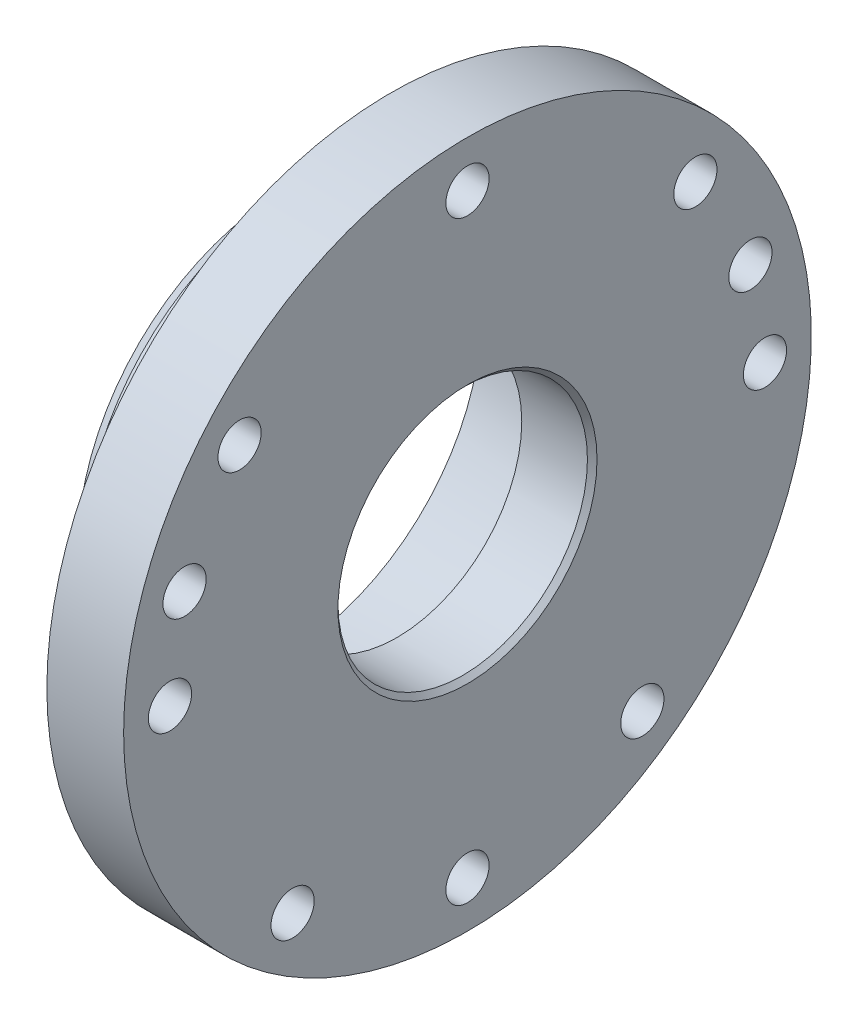
ISO-10303-21;
HEADER;
FILE_DESCRIPTION(('STEP AP214'),'2;1');
FILE_NAME('part.step','',(''),(''),'','','');
FILE_SCHEMA(('AUTOMOTIVE_DESIGN { 1 0 10303 214 1 1 1 1 }'));
ENDSEC;
DATA;
#1=APPLICATION_CONTEXT('core data for automotive mechanical design processes');
#2=APPLICATION_PROTOCOL_DEFINITION('international standard','automotive_design',2000,#1);
#3=PRODUCT_CONTEXT('',#1,'mechanical');
#4=PRODUCT('Part','Part','',(#3));
#5=PRODUCT_RELATED_PRODUCT_CATEGORY('part','',(#4));
#6=PRODUCT_DEFINITION_FORMATION('','',#4);
#7=PRODUCT_DEFINITION_CONTEXT('part definition',#1,'design');
#8=PRODUCT_DEFINITION('design','',#6,#7);
#9=PRODUCT_DEFINITION_SHAPE('','',#8);
#10=(LENGTH_UNIT() NAMED_UNIT(*) SI_UNIT(.MILLI.,.METRE.));
#11=(NAMED_UNIT(*) PLANE_ANGLE_UNIT() SI_UNIT($,.RADIAN.));
#12=(NAMED_UNIT(*) SI_UNIT($,.STERADIAN.) SOLID_ANGLE_UNIT());
#13=UNCERTAINTY_MEASURE_WITH_UNIT(LENGTH_MEASURE(1.E-05),#10,'distance_accuracy_value','');
#14=(GEOMETRIC_REPRESENTATION_CONTEXT(3) GLOBAL_UNCERTAINTY_ASSIGNED_CONTEXT((#13)) GLOBAL_UNIT_ASSIGNED_CONTEXT((#10,
#11,#12)) REPRESENTATION_CONTEXT('',''));
#15=CARTESIAN_POINT('',(0.,0.,0.));
#16=DIRECTION('',(0.,0.,1.));
#17=DIRECTION('',(1.,0.,0.));
#18=AXIS2_PLACEMENT_3D('',#15,#16,#17);
#19=CARTESIAN_POINT('',(0.,0.,0.));
#20=DIRECTION('',(-1.,0.,0.));
#21=DIRECTION('',(0.,0.,1.));
#22=AXIS2_PLACEMENT_3D('',#19,#20,#21);
#23=CYLINDRICAL_SURFACE('',#22,70.0151);
#24=CARTESIAN_POINT('',(34.3408,0.,0.));
#25=DIRECTION('',(1.,0.,0.));
#26=DIRECTION('',(0.,0.,-1.));
#27=AXIS2_PLACEMENT_3D('',#24,#25,#26);
#28=CIRCLE('',#27,70.0151);
#29=CARTESIAN_POINT('',(34.3408,0.,-70.0151));
#30=VERTEX_POINT('',#29);
#31=EDGE_CURVE('E208',#30,#30,#28,.F.);
#32=ORIENTED_EDGE('',*,*,#31,.T.);
#33=EDGE_LOOP('',(#32));
#34=FACE_BOUND('',#33,.T.);
#35=CARTESIAN_POINT('',(25.6794,0.,0.));
#36=DIRECTION('',(-1.,0.,0.));
#37=DIRECTION('',(0.,0.,1.));
#38=AXIS2_PLACEMENT_3D('',#35,#36,#37);
#39=CIRCLE('',#38,70.0151);
#40=CARTESIAN_POINT('',(25.6794,0.,70.0151));
#41=VERTEX_POINT('',#40);
#42=EDGE_CURVE('E136',#41,#41,#39,.T.);
#43=ORIENTED_EDGE('',*,*,#42,.F.);
#44=EDGE_LOOP('',(#43));
#45=FACE_BOUND('',#44,.T.);
#46=ADVANCED_FACE('F35',(#34,#45),#23,.T.);
#47=CARTESIAN_POINT('',(3.17500000000002,0.,0.));
#48=DIRECTION('',(1.,0.,0.));
#49=DIRECTION('',(0.,0.,-1.));
#50=AXIS2_PLACEMENT_3D('',#47,#48,#49);
#51=CIRCLE('',#50,70.0151);
#52=CARTESIAN_POINT('',(3.17500000000002,-69.5637141170596,-7.9375));
#53=VERTEX_POINT('',#52);
#54=CARTESIAN_POINT('',(3.17500000000002,-69.5637141170596,7.9375));
#55=VERTEX_POINT('',#54);
#56=EDGE_CURVE('E217',#53,#55,#51,.T.);
#57=ORIENTED_EDGE('',*,*,#56,.T.);
#58=DIRECTION('',(-1.,0.,0.));
#59=VECTOR('',#58,1.);
#60=CARTESIAN_POINT('',(0.,-69.5637141170596,7.9375));
#61=LINE('',#60,#59);
#62=CARTESIAN_POINT('',(12.7,-69.5637141170596,7.9375));
#63=VERTEX_POINT('',#62);
#64=EDGE_CURVE('E60',#55,#63,#61,.F.);
#65=ORIENTED_EDGE('',*,*,#64,.T.);
#66=CARTESIAN_POINT('',(12.7,0.,0.));
#67=DIRECTION('',(1.,0.,0.));
#68=DIRECTION('',(0.,0.,-1.));
#69=AXIS2_PLACEMENT_3D('',#66,#67,#68);
#70=CIRCLE('',#69,70.0151);
#71=CARTESIAN_POINT('',(12.7,-69.5637141170596,-7.9375));
#72=VERTEX_POINT('',#71);
#73=EDGE_CURVE('E100',#63,#72,#70,.T.);
#74=ORIENTED_EDGE('',*,*,#73,.T.);
#75=DIRECTION('',(-1.,0.,0.));
#76=VECTOR('',#75,1.);
#77=CARTESIAN_POINT('',(0.,-69.5637141170596,-7.9375));
#78=LINE('',#77,#76);
#79=EDGE_CURVE('E84',#72,#53,#78,.T.);
#80=ORIENTED_EDGE('',*,*,#79,.T.);
#81=EDGE_LOOP('',(#57,#65,#74,#80));
#82=FACE_BOUND('',#81,.T.);
#83=CARTESIAN_POINT('',(20.8788,0.,0.));
#84=DIRECTION('',(1.,0.,0.));
#85=DIRECTION('',(0.,0.,-1.));
#86=AXIS2_PLACEMENT_3D('',#83,#84,#85);
#87=CIRCLE('',#86,70.0151);
#88=CARTESIAN_POINT('',(20.8788,0.,-70.0151));
#89=VERTEX_POINT('',#88);
#90=EDGE_CURVE('E122',#89,#89,#87,.T.);
#91=ORIENTED_EDGE('',*,*,#90,.F.);
#92=EDGE_LOOP('',(#91));
#93=FACE_BOUND('',#92,.T.);
#94=ADVANCED_FACE('F102',(#82,#93),#23,.T.);
#95=CARTESIAN_POINT('',(0.,0.,0.));
#96=DIRECTION('',(-1.,0.,0.));
#97=DIRECTION('',(0.,0.,1.));
#98=AXIS2_PLACEMENT_3D('',#95,#96,#97);
#99=CONICAL_SURFACE('',#98,65.0875,0.0872664625997166);
#100=CARTESIAN_POINT('',(30.2297267597372,0.,0.));
#101=DIRECTION('',(-1.,0.,0.));
#102=DIRECTION('',(0.,0.,1.));
#103=AXIS2_PLACEMENT_3D('',#100,#101,#102);
#104=CIRCLE('',#103,62.4427416070367);
#105=CARTESIAN_POINT('',(30.2297267597372,0.,62.4427416070367));
#106=VERTEX_POINT('',#105);
#107=EDGE_CURVE('E199',#106,#106,#104,.T.);
#108=ORIENTED_EDGE('',*,*,#107,.F.);
#109=EDGE_LOOP('',(#108));
#110=FACE_BOUND('',#109,.T.);
#111=CARTESIAN_POINT('',(12.7,0.,0.));
#112=DIRECTION('',(1.,0.,0.));
#113=DIRECTION('',(0.,0.,-1.));
#114=AXIS2_PLACEMENT_3D('',#111,#112,#113);
#115=CIRCLE('',#114,63.9763939732208);
#116=CARTESIAN_POINT('',(12.7,-63.4820847134588,-7.9375));
#117=VERTEX_POINT('',#116);
#118=CARTESIAN_POINT('',(12.7,-63.4820847134588,7.9375));
#119=VERTEX_POINT('',#118);
#120=EDGE_CURVE('E11',#117,#119,#115,.F.);
#121=ORIENTED_EDGE('',*,*,#120,.T.);
#122=CARTESIAN_POINT('',(79.0151504731022,-57.6305188119541,7.9375));
#123=CARTESIAN_POINT('',(61.2473709320741,-59.1996496180577,7.9375));
#124=CARTESIAN_POINT('',(43.4794910551502,-60.7676438073892,7.9375));
#125=CARTESIAN_POINT('',(7.94356542547058,-63.9017502639271,7.9375));
#126=CARTESIAN_POINT('',(-9.82448032728422,-65.4678625311449,7.9375));
#127=CARTESIAN_POINT('',(-34.0463349213385,-67.6018029546642,7.9375));
#128=CARTESIAN_POINT('',(-40.5000867762412,-68.1702780805867,7.9375));
#129=CARTESIAN_POINT('',(-53.4076067240651,-69.3070441176885,7.9375));
#130=CARTESIAN_POINT('',(-59.8613748169862,-69.8753350288673,7.9375));
#131=CARTESIAN_POINT('',(-66.3151504731022,-70.4435400503315,7.9375));
#132=B_SPLINE_CURVE_WITH_KNOTS('',3,(#122,#123,#124,#125,#126,#127,#128,#129,#130,#131),
.UNSPECIFIED.,.F.,.F.,(4,2,2,2,4),(0.,53.5107974305862,107.021594538209,126.457815691513,
145.894036887121),.UNSPECIFIED.);
#133=CARTESIAN_POINT('',(0.,-64.6016930892682,7.9375));
#134=VERTEX_POINT('',#133);
#135=EDGE_CURVE('E105',#119,#134,#132,.T.);
#136=ORIENTED_EDGE('',*,*,#135,.T.);
#137=CARTESIAN_POINT('',(0.,0.,0.));
#138=DIRECTION('',(-1.,0.,0.));
#139=DIRECTION('',(0.,0.,1.));
#140=AXIS2_PLACEMENT_3D('',#137,#138,#139);
#141=CIRCLE('',#140,65.0875);
#142=CARTESIAN_POINT('',(0.,-64.6016930892682,-7.9375));
#143=VERTEX_POINT('',#142);
#144=EDGE_CURVE('E182',#134,#143,#141,.T.);
#145=ORIENTED_EDGE('',*,*,#144,.T.);
#146=CARTESIAN_POINT('',(-66.3151504731022,-70.4435400503315,-7.9375));
#147=CARTESIAN_POINT('',(-55.489322891296,-69.4904082780563,-7.9375));
#148=CARTESIAN_POINT('',(-44.6635163076476,-68.5370380440227,-7.9375));
#149=CARTESIAN_POINT('',(-23.0119512193014,-66.6297515457216,-7.9375));
#150=CARTESIAN_POINT('',(-12.1861927146037,-65.675835281453,-7.9375));
#151=CARTESIAN_POINT('',(20.2910012596043,-62.813163809436,-7.9375));
#152=CARTESIAN_POINT('',(41.9423554229091,-60.9034859019059,-7.9375));
#153=CARTESIAN_POINT('',(68.7341021620195,-58.538384669189,-7.9375));
#154=CARTESIAN_POINT('',(73.8746306141872,-58.0845003920235,-7.9375));
#155=CARTESIAN_POINT('',(79.0151504731022,-57.6305188119541,-7.9375));
#156=B_SPLINE_CURVE_WITH_KNOTS('',3,(#146,#147,#148,#149,#150,#151,#152,#153,#154,#155),
.UNSPECIFIED.,.F.,.F.,(4,2,2,2,4),(0.,32.6031137518608,65.2062275677975,130.412454495922,
145.894036884604),.UNSPECIFIED.);
#157=EDGE_CURVE('E94',#143,#117,#156,.T.);
#158=ORIENTED_EDGE('',*,*,#157,.T.);
#159=EDGE_LOOP('',(#121,#136,#145,#158));
#160=FACE_BOUND('',#159,.T.);
#161=ADVANCED_FACE('F244',(#110,#160),#99,.F.);
#162=CARTESIAN_POINT('',(29.5656,0.,0.));
#163=DIRECTION('',(-1.,0.,0.));
#164=DIRECTION('',(0.,0.,1.));
#165=AXIS2_PLACEMENT_3D('',#162,#163,#164);
#166=TOROIDAL_SURFACE('',#165,54.8517380075776,7.62);
#167=CARTESIAN_POINT('',(37.1856,0.,0.));
#168=DIRECTION('',(-1.,0.,0.));
#169=DIRECTION('',(0.,0.,1.));
#170=AXIS2_PLACEMENT_3D('',#167,#168,#169);
#171=CIRCLE('',#170,54.8517380075776);
#172=CARTESIAN_POINT('',(37.1856,0.,54.8517380075776));
#173=VERTEX_POINT('',#172);
#174=EDGE_CURVE('E196',#173,#173,#171,.T.);
#175=ORIENTED_EDGE('',*,*,#174,.F.);
#176=EDGE_LOOP('',(#175));
#177=FACE_BOUND('',#176,.T.);
#178=ORIENTED_EDGE('',*,*,#107,.T.);
#179=EDGE_LOOP('',(#178));
#180=FACE_BOUND('',#179,.T.);
#181=ADVANCED_FACE('F249',(#177,#180),#166,.F.);
#182=CARTESIAN_POINT('',(37.1856,41.275,0.));
#183=DIRECTION('',(1.,0.,0.));
#184=DIRECTION('',(0.,0.,-1.));
#185=AXIS2_PLACEMENT_3D('',#182,#183,#184);
#186=PLANE('',#185);
#187=CARTESIAN_POINT('',(37.1856,0.,0.));
#188=DIRECTION('',(-1.,0.,0.));
#189=DIRECTION('',(0.,0.,1.));
#190=AXIS2_PLACEMENT_3D('',#187,#188,#189);
#191=CIRCLE('',#190,41.275);
#192=CARTESIAN_POINT('',(37.1856,0.,41.275));
#193=VERTEX_POINT('',#192);
#194=EDGE_CURVE('E193',#193,#193,#191,.T.);
#195=ORIENTED_EDGE('',*,*,#194,.F.);
#196=EDGE_LOOP('',(#195));
#197=FACE_BOUND('',#196,.T.);
#198=ORIENTED_EDGE('',*,*,#174,.T.);
#199=EDGE_LOOP('',(#198));
#200=FACE_BOUND('',#199,.T.);
#201=ADVANCED_FACE('F300',(#197,#200),#186,.F.);
#202=CARTESIAN_POINT('',(0.,0.,0.));
#203=DIRECTION('',(-1.,0.,0.));
#204=DIRECTION('',(0.,0.,1.));
#205=AXIS2_PLACEMENT_3D('',#202,#203,#204);
#206=CYLINDRICAL_SURFACE('',#205,41.275);
#207=CARTESIAN_POINT('',(58.9153000000001,0.,0.));
#208=DIRECTION('',(-1.,0.,0.));
#209=DIRECTION('',(0.,0.,1.));
#210=AXIS2_PLACEMENT_3D('',#207,#208,#209);
#211=CIRCLE('',#210,41.275);
#212=CARTESIAN_POINT('',(58.9153000000001,0.,-41.275));
#213=VERTEX_POINT('',#212);
#214=EDGE_CURVE('E205',#213,#213,#211,.F.);
#215=ORIENTED_EDGE('',*,*,#214,.T.);
#216=EDGE_LOOP('',(#215));
#217=FACE_BOUND('',#216,.T.);
#218=ORIENTED_EDGE('',*,*,#194,.T.);
#219=EDGE_LOOP('',(#218));
#220=FACE_BOUND('',#219,.T.);
#221=ADVANCED_FACE('F297',(#217,#220),#206,.F.);
#222=CARTESIAN_POINT('',(60.5028,113.7666,0.));
#223=DIRECTION('',(-1.,0.,0.));
#224=DIRECTION('',(0.,0.,1.));
#225=AXIS2_PLACEMENT_3D('',#222,#223,#224);
#226=PLANE('',#225);
#227=CARTESIAN_POINT('',(60.5028,63.266370483398,-75.3979243139851));
#228=DIRECTION('',(-1.,0.,0.));
#229=DIRECTION('',(0.,-0.766044443118975,-0.642787609686543));
#230=AXIS2_PLACEMENT_3D('',#227,#228,#229);
#231=CIRCLE('',#230,7.1501);
#232=CARTESIAN_POINT('',(60.5028,57.789076110653,-79.9939200020049));
#233=VERTEX_POINT('',#232);
#234=EDGE_CURVE('E123',#233,#233,#231,.T.);
#235=ORIENTED_EDGE('',*,*,#234,.T.);
#236=EDGE_LOOP('',(#235));
#237=FACE_BOUND('',#236,.T.);
#238=CARTESIAN_POINT('',(60.5028,63.266370483397,75.397924313986));
#239=DIRECTION('',(-1.,0.,0.));
#240=DIRECTION('',(0.,0.766044443118984,-0.642787609686533));
#241=AXIS2_PLACEMENT_3D('',#238,#239,#240);
#242=CIRCLE('',#241,7.1501);
#243=CARTESIAN_POINT('',(60.5028,68.743664856142,70.8019286259663));
#244=VERTEX_POINT('',#243);
#245=EDGE_CURVE('E130',#244,#244,#242,.T.);
#246=ORIENTED_EDGE('',*,*,#245,.T.);
#247=EDGE_LOOP('',(#246));
#248=FACE_BOUND('',#247,.T.);
#249=CARTESIAN_POINT('',(60.5028,-98.425,0.));
#250=DIRECTION('',(-1.,0.,0.));
#251=DIRECTION('',(0.,0.,1.));
#252=AXIS2_PLACEMENT_3D('',#249,#250,#251);
#253=CIRCLE('',#252,7.1501);
#254=CARTESIAN_POINT('',(60.5028,-98.425,7.1501));
#255=VERTEX_POINT('',#254);
#256=EDGE_CURVE('E137',#255,#255,#253,.T.);
#257=ORIENTED_EDGE('',*,*,#256,.T.);
#258=EDGE_LOOP('',(#257));
#259=FACE_BOUND('',#258,.T.);
#260=CARTESIAN_POINT('',(60.5028,0.,98.425));
#261=DIRECTION('',(1.,0.,0.));
#262=DIRECTION('',(0.,0.,-1.));
#263=AXIS2_PLACEMENT_3D('',#260,#261,#262);
#264=CIRCLE('',#263,7.15009999999999);
#265=CARTESIAN_POINT('',(60.5028,0.,91.2749));
#266=VERTEX_POINT('',#265);
#267=EDGE_CURVE('E143',#266,#266,#264,.T.);
#268=ORIENTED_EDGE('',*,*,#267,.F.);
#269=EDGE_LOOP('',(#268));
#270=FACE_BOUND('',#269,.T.);
#271=CARTESIAN_POINT('',(60.5028,0.,-98.425));
#272=DIRECTION('',(-1.,0.,0.));
#273=DIRECTION('',(0.,0.,1.));
#274=AXIS2_PLACEMENT_3D('',#271,#272,#273);
#275=CIRCLE('',#274,7.15009999999999);
#276=CARTESIAN_POINT('',(60.5028,0.,-91.2749));
#277=VERTEX_POINT('',#276);
#278=EDGE_CURVE('E149',#277,#277,#275,.T.);
#279=ORIENTED_EDGE('',*,*,#278,.T.);
#280=EDGE_LOOP('',(#279));
#281=FACE_BOUND('',#280,.T.);
#282=CARTESIAN_POINT('',(60.5028,30.4149976713539,-93.6077376163506));
#283=DIRECTION('',(-1.,0.,0.));
#284=DIRECTION('',(0.,0.951056516295155,0.309016994374945));
#285=AXIS2_PLACEMENT_3D('',#282,#283,#284);
#286=CIRCLE('',#285,7.1501);
#287=CARTESIAN_POINT('',(60.5028,37.2151468685159,-91.3982352048703));
#288=VERTEX_POINT('',#287);
#289=EDGE_CURVE('E155',#288,#288,#286,.T.);
#290=ORIENTED_EDGE('',*,*,#289,.T.);
#291=EDGE_LOOP('',(#290));
#292=FACE_BOUND('',#291,.T.);
#293=CARTESIAN_POINT('',(60.5028,-79.6274976713545,-57.8527634568862));
#294=DIRECTION('',(-1.,0.,0.));
#295=DIRECTION('',(0.,0.587785252292469,-0.809016994374951));
#296=AXIS2_PLACEMENT_3D('',#293,#294,#295);
#297=CIRCLE('',#296,7.1501);
#298=CARTESIAN_POINT('',(60.5028,-75.4247743389381,-63.6373158683665));
#299=VERTEX_POINT('',#298);
#300=EDGE_CURVE('E162',#299,#299,#297,.T.);
#301=ORIENTED_EDGE('',*,*,#300,.T.);
#302=EDGE_LOOP('',(#301));
#303=FACE_BOUND('',#302,.T.);
#304=CARTESIAN_POINT('',(60.5028,-79.6274976713537,57.8527634568874));
#305=DIRECTION('',(-1.,0.,0.));
#306=DIRECTION('',(0.,-0.58778525229248,-0.809016994374942));
#307=AXIS2_PLACEMENT_3D('',#304,#305,#306);
#308=CIRCLE('',#307,7.1501);
#309=CARTESIAN_POINT('',(60.5028,-83.8302210037701,52.0682110454071));
#310=VERTEX_POINT('',#309);
#311=EDGE_CURVE('E168',#310,#310,#308,.T.);
#312=ORIENTED_EDGE('',*,*,#311,.T.);
#313=EDGE_LOOP('',(#312));
#314=FACE_BOUND('',#313,.T.);
#315=CARTESIAN_POINT('',(60.5028,30.4149976713553,93.6077376163501));
#316=DIRECTION('',(-1.,0.,0.));
#317=DIRECTION('',(0.,-0.95105651629515,0.309016994374958));
#318=AXIS2_PLACEMENT_3D('',#315,#316,#317);
#319=CIRCLE('',#318,7.1501);
#320=CARTESIAN_POINT('',(60.5028,23.6148484741933,95.8172400278305));
#321=VERTEX_POINT('',#320);
#322=EDGE_CURVE('E174',#321,#321,#319,.T.);
#323=ORIENTED_EDGE('',*,*,#322,.T.);
#324=EDGE_LOOP('',(#323));
#325=FACE_BOUND('',#324,.T.);
#326=CARTESIAN_POINT('',(60.5028,98.425,0.));
#327=DIRECTION('',(-1.,0.,0.));
#328=DIRECTION('',(0.,0.,1.));
#329=AXIS2_PLACEMENT_3D('',#326,#327,#328);
#330=CIRCLE('',#329,7.1501);
#331=CARTESIAN_POINT('',(60.5028,98.425,7.1501));
#332=VERTEX_POINT('',#331);
#333=EDGE_CURVE('E179',#332,#332,#330,.T.);
#334=ORIENTED_EDGE('',*,*,#333,.T.);
#335=EDGE_LOOP('',(#334));
#336=FACE_BOUND('',#335,.T.);
#337=CARTESIAN_POINT('',(60.5028,0.,0.));
#338=DIRECTION('',(-1.,0.,0.));
#339=DIRECTION('',(0.,0.,1.));
#340=AXIS2_PLACEMENT_3D('',#337,#338,#339);
#341=CIRCLE('',#340,42.8624999999999);
#342=CARTESIAN_POINT('',(60.5028,0.,-42.8624999999999));
#343=VERTEX_POINT('',#342);
#344=EDGE_CURVE('E202',#343,#343,#341,.T.);
#345=ORIENTED_EDGE('',*,*,#344,.T.);
#346=EDGE_LOOP('',(#345));
#347=FACE_BOUND('',#346,.T.);
#348=CARTESIAN_POINT('',(60.5028,0.,0.));
#349=DIRECTION('',(-1.,0.,0.));
#350=DIRECTION('',(0.,0.,1.));
#351=AXIS2_PLACEMENT_3D('',#348,#349,#350);
#352=CIRCLE('',#351,113.7666);
#353=CARTESIAN_POINT('',(60.5028,0.,113.7666));
#354=VERTEX_POINT('',#353);
#355=EDGE_CURVE('E190',#354,#354,#352,.T.);
#356=ORIENTED_EDGE('',*,*,#355,.F.);
#357=EDGE_LOOP('',(#356));
#358=FACE_BOUND('',#357,.T.);
#359=ADVANCED_FACE('F293',(#237,#248,#259,#270,#281,#292,#303,#314,#325,#336,#347,#358),#226,.F.);
#360=CARTESIAN_POINT('',(0.,0.,0.));
#361=DIRECTION('',(-1.,0.,0.));
#362=DIRECTION('',(0.,0.,1.));
#363=AXIS2_PLACEMENT_3D('',#360,#361,#362);
#364=CYLINDRICAL_SURFACE('',#363,113.7666);
#365=CARTESIAN_POINT('',(35.1028,0.,0.));
#366=DIRECTION('',(-1.,0.,0.));
#367=DIRECTION('',(0.,0.,1.));
#368=AXIS2_PLACEMENT_3D('',#365,#366,#367);
#369=CIRCLE('',#368,113.7666);
#370=CARTESIAN_POINT('',(35.1028,0.,113.7666));
#371=VERTEX_POINT('',#370);
#372=EDGE_CURVE('E187',#371,#371,#369,.T.);
#373=ORIENTED_EDGE('',*,*,#372,.F.);
#374=EDGE_LOOP('',(#373));
#375=FACE_BOUND('',#374,.T.);
#376=ORIENTED_EDGE('',*,*,#355,.T.);
#377=EDGE_LOOP('',(#376));
#378=FACE_BOUND('',#377,.T.);
#379=ADVANCED_FACE('F289',(#375,#378),#364,.T.);
#380=CARTESIAN_POINT('',(35.1028,70.0151,0.));
#381=DIRECTION('',(1.,0.,0.));
#382=DIRECTION('',(0.,0.,-1.));
#383=AXIS2_PLACEMENT_3D('',#380,#381,#382);
#384=PLANE('',#383);
#385=CARTESIAN_POINT('',(35.1028,63.266370483398,-75.3979243139851));
#386=DIRECTION('',(-1.,0.,0.));
#387=DIRECTION('',(0.,-0.766044443118975,-0.642787609686543));
#388=AXIS2_PLACEMENT_3D('',#385,#386,#387);
#389=CIRCLE('',#388,7.1501);
#390=CARTESIAN_POINT('',(35.1028,57.789076110653,-79.9939200020049));
#391=VERTEX_POINT('',#390);
#392=EDGE_CURVE('E127',#391,#391,#389,.T.);
#393=ORIENTED_EDGE('',*,*,#392,.F.);
#394=EDGE_LOOP('',(#393));
#395=FACE_BOUND('',#394,.T.);
#396=CARTESIAN_POINT('',(35.1028,63.266370483397,75.397924313986));
#397=DIRECTION('',(-1.,0.,0.));
#398=DIRECTION('',(0.,0.766044443118984,-0.642787609686533));
#399=AXIS2_PLACEMENT_3D('',#396,#397,#398);
#400=CIRCLE('',#399,7.1501);
#401=CARTESIAN_POINT('',(35.1028,68.743664856142,70.8019286259663));
#402=VERTEX_POINT('',#401);
#403=EDGE_CURVE('E133',#402,#402,#400,.T.);
#404=ORIENTED_EDGE('',*,*,#403,.F.);
#405=EDGE_LOOP('',(#404));
#406=FACE_BOUND('',#405,.T.);
#407=CARTESIAN_POINT('',(35.1028,-98.425,0.));
#408=DIRECTION('',(-1.,0.,0.));
#409=DIRECTION('',(0.,0.,1.));
#410=AXIS2_PLACEMENT_3D('',#407,#408,#409);
#411=CIRCLE('',#410,7.1501);
#412=CARTESIAN_POINT('',(35.1028,-98.425,7.1501));
#413=VERTEX_POINT('',#412);
#414=EDGE_CURVE('E126',#413,#413,#411,.T.);
#415=ORIENTED_EDGE('',*,*,#414,.F.);
#416=EDGE_LOOP('',(#415));
#417=FACE_BOUND('',#416,.T.);
#418=CARTESIAN_POINT('',(35.1028,0.,98.425));
#419=DIRECTION('',(1.,0.,0.));
#420=DIRECTION('',(0.,0.,-1.));
#421=AXIS2_PLACEMENT_3D('',#418,#419,#420);
#422=CIRCLE('',#421,7.15009999999999);
#423=CARTESIAN_POINT('',(35.1028,0.,91.2749));
#424=VERTEX_POINT('',#423);
#425=EDGE_CURVE('E140',#424,#424,#422,.T.);
#426=ORIENTED_EDGE('',*,*,#425,.T.);
#427=EDGE_LOOP('',(#426));
#428=FACE_BOUND('',#427,.T.);
#429=CARTESIAN_POINT('',(35.1028,0.,-98.425));
#430=DIRECTION('',(-1.,0.,0.));
#431=DIRECTION('',(0.,0.,1.));
#432=AXIS2_PLACEMENT_3D('',#429,#430,#431);
#433=CIRCLE('',#432,7.15009999999999);
#434=CARTESIAN_POINT('',(35.1028,0.,-91.2749));
#435=VERTEX_POINT('',#434);
#436=EDGE_CURVE('E146',#435,#435,#433,.T.);
#437=ORIENTED_EDGE('',*,*,#436,.F.);
#438=EDGE_LOOP('',(#437));
#439=FACE_BOUND('',#438,.T.);
#440=CARTESIAN_POINT('',(35.1028,0.,0.));
#441=DIRECTION('',(1.,0.,0.));
#442=DIRECTION('',(0.,0.,-1.));
#443=AXIS2_PLACEMENT_3D('',#440,#441,#442);
#444=CIRCLE('',#443,70.7771);
#445=CARTESIAN_POINT('',(35.1028,0.,-70.7771));
#446=VERTEX_POINT('',#445);
#447=EDGE_CURVE('E211',#446,#446,#444,.T.);
#448=ORIENTED_EDGE('',*,*,#447,.T.);
#449=EDGE_LOOP('',(#448));
#450=FACE_BOUND('',#449,.T.);
#451=CARTESIAN_POINT('',(35.1028,30.4149976713539,-93.6077376163506));
#452=DIRECTION('',(-1.,0.,0.));
#453=DIRECTION('',(0.,0.951056516295155,0.309016994374945));
#454=AXIS2_PLACEMENT_3D('',#451,#452,#453);
#455=CIRCLE('',#454,7.1501);
#456=CARTESIAN_POINT('',(35.1028,37.2151468685159,-91.3982352048703));
#457=VERTEX_POINT('',#456);
#458=EDGE_CURVE('E159',#457,#457,#455,.T.);
#459=ORIENTED_EDGE('',*,*,#458,.F.);
#460=EDGE_LOOP('',(#459));
#461=FACE_BOUND('',#460,.T.);
#462=CARTESIAN_POINT('',(35.1028,-79.6274976713545,-57.8527634568862));
#463=DIRECTION('',(-1.,0.,0.));
#464=DIRECTION('',(0.,0.587785252292469,-0.809016994374951));
#465=AXIS2_PLACEMENT_3D('',#462,#463,#464);
#466=CIRCLE('',#465,7.1501);
#467=CARTESIAN_POINT('',(35.1028,-75.4247743389381,-63.6373158683665));
#468=VERTEX_POINT('',#467);
#469=EDGE_CURVE('E165',#468,#468,#466,.T.);
#470=ORIENTED_EDGE('',*,*,#469,.F.);
#471=EDGE_LOOP('',(#470));
#472=FACE_BOUND('',#471,.T.);
#473=CARTESIAN_POINT('',(35.1028,-79.6274976713537,57.8527634568874));
#474=DIRECTION('',(-1.,0.,0.));
#475=DIRECTION('',(0.,-0.58778525229248,-0.809016994374942));
#476=AXIS2_PLACEMENT_3D('',#473,#474,#475);
#477=CIRCLE('',#476,7.1501);
#478=CARTESIAN_POINT('',(35.1028,-83.8302210037701,52.0682110454071));
#479=VERTEX_POINT('',#478);
#480=EDGE_CURVE('E171',#479,#479,#477,.T.);
#481=ORIENTED_EDGE('',*,*,#480,.F.);
#482=EDGE_LOOP('',(#481));
#483=FACE_BOUND('',#482,.T.);
#484=CARTESIAN_POINT('',(35.1028,30.4149976713553,93.6077376163501));
#485=DIRECTION('',(-1.,0.,0.));
#486=DIRECTION('',(0.,-0.95105651629515,0.309016994374958));
#487=AXIS2_PLACEMENT_3D('',#484,#485,#486);
#488=CIRCLE('',#487,7.1501);
#489=CARTESIAN_POINT('',(35.1028,23.6148484741933,95.8172400278305));
#490=VERTEX_POINT('',#489);
#491=EDGE_CURVE('E152',#490,#490,#488,.T.);
#492=ORIENTED_EDGE('',*,*,#491,.F.);
#493=EDGE_LOOP('',(#492));
#494=FACE_BOUND('',#493,.T.);
#495=CARTESIAN_POINT('',(35.1028,98.425,0.));
#496=DIRECTION('',(-1.,0.,0.));
#497=DIRECTION('',(0.,0.,1.));
#498=AXIS2_PLACEMENT_3D('',#495,#496,#497);
#499=CIRCLE('',#498,7.1501);
#500=CARTESIAN_POINT('',(35.1028,98.425,7.1501));
#501=VERTEX_POINT('',#500);
#502=EDGE_CURVE('E158',#501,#501,#499,.T.);
#503=ORIENTED_EDGE('',*,*,#502,.F.);
#504=EDGE_LOOP('',(#503));
#505=FACE_BOUND('',#504,.T.);
#506=ORIENTED_EDGE('',*,*,#372,.T.);
#507=EDGE_LOOP('',(#506));
#508=FACE_BOUND('',#507,.T.);
#509=ADVANCED_FACE('F286',(#395,#406,#417,#428,#439,#450,#461,#472,#483,#494,#505,#508),#384,.F.);
#510=CARTESIAN_POINT('',(0.,65.0875,0.));
#511=DIRECTION('',(1.,0.,0.));
#512=DIRECTION('',(0.,0.,-1.));
#513=AXIS2_PLACEMENT_3D('',#510,#511,#512);
#514=PLANE('',#513);
#515=ORIENTED_EDGE('',*,*,#144,.F.);
#516=DIRECTION('',(0.,1.,0.));
#517=VECTOR('',#516,1.);
#518=CARTESIAN_POINT('',(0.,-113.7666,7.9375));
#519=LINE('',#518,#517);
#520=CARTESIAN_POINT('',(0.,-67.9656717432411,7.9375));
#521=VERTEX_POINT('',#520);
#522=EDGE_CURVE('E318',#521,#134,#519,.T.);
#523=ORIENTED_EDGE('',*,*,#522,.F.);
#524=CARTESIAN_POINT('',(0.,0.,0.));
#525=DIRECTION('',(1.,0.,0.));
#526=DIRECTION('',(0.,0.,-1.));
#527=AXIS2_PLACEMENT_3D('',#524,#525,#526);
#528=CIRCLE('',#527,68.4276);
#529=CARTESIAN_POINT('',(0.,-67.9656717432411,-7.9375));
#530=VERTEX_POINT('',#529);
#531=EDGE_CURVE('E214',#521,#530,#528,.F.);
#532=ORIENTED_EDGE('',*,*,#531,.T.);
#533=DIRECTION('',(0.,1.,0.));
#534=VECTOR('',#533,1.);
#535=CARTESIAN_POINT('',(0.,-113.7666,-7.9375));
#536=LINE('',#535,#534);
#537=EDGE_CURVE('E52',#530,#143,#536,.T.);
#538=ORIENTED_EDGE('',*,*,#537,.T.);
#539=EDGE_LOOP('',(#515,#523,#532,#538));
#540=FACE_BOUND('',#539,.T.);
#541=ADVANCED_FACE('F259',(#540),#514,.F.);
#542=CARTESIAN_POINT('',(60.5028,0.,0.));
#543=DIRECTION('',(1.,0.,0.));
#544=DIRECTION('',(0.,0.,-1.));
#545=AXIS2_PLACEMENT_3D('',#542,#543,#544);
#546=CONICAL_SURFACE('',#545,42.8624999999999,0.785398163397448);
#547=CARTESIAN_POINT('',(58.9153000000001,0.,-41.275));
#548=CARTESIAN_POINT('',(58.9318364583334,0.,-41.2915364583333));
#549=CARTESIAN_POINT('',(58.9483729166667,0.,-41.3080729166667));
#550=CARTESIAN_POINT('',(58.9814458333334,0.,-41.3411458333333));
#551=CARTESIAN_POINT('',(58.9979822916667,0.,-41.3576822916667));
#552=CARTESIAN_POINT('',(59.0310552083334,0.,-41.3907552083333));
#553=CARTESIAN_POINT('',(59.0475916666667,0.,-41.4072916666667));
#554=CARTESIAN_POINT('',(59.0806645833334,0.,-41.4403645833333));
#555=CARTESIAN_POINT('',(59.0972010416667,0.,-41.4569010416667));
#556=CARTESIAN_POINT('',(59.1302739583334,0.,-41.4899739583333));
#557=CARTESIAN_POINT('',(59.1468104166667,0.,-41.5065104166667));
#558=CARTESIAN_POINT('',(59.1798833333334,0.,-41.5395833333333));
#559=CARTESIAN_POINT('',(59.1964197916667,0.,-41.5561197916667));
#560=CARTESIAN_POINT('',(59.2294927083334,0.,-41.5891927083333));
#561=CARTESIAN_POINT('',(59.2460291666667,0.,-41.6057291666667));
#562=CARTESIAN_POINT('',(59.2791020833334,0.,-41.6388020833333));
#563=CARTESIAN_POINT('',(59.2956385416667,0.,-41.6553385416667));
#564=CARTESIAN_POINT('',(59.3287114583334,0.,-41.6884114583333));
#565=CARTESIAN_POINT('',(59.3452479166667,0.,-41.7049479166667));
#566=CARTESIAN_POINT('',(59.3783208333334,0.,-41.7380208333333));
#567=CARTESIAN_POINT('',(59.3948572916667,0.,-41.7545572916667));
#568=CARTESIAN_POINT('',(59.4279302083334,0.,-41.7876302083333));
#569=CARTESIAN_POINT('',(59.4444666666667,0.,-41.8041666666666));
#570=CARTESIAN_POINT('',(59.4775395833334,0.,-41.8372395833333));
#571=CARTESIAN_POINT('',(59.4940760416667,0.,-41.8537760416666));
#572=CARTESIAN_POINT('',(59.5271489583334,0.,-41.8868489583333));
#573=CARTESIAN_POINT('',(59.5436854166667,0.,-41.9033854166666));
#574=CARTESIAN_POINT('',(59.5767583333334,0.,-41.9364583333333));
#575=CARTESIAN_POINT('',(59.5932947916667,0.,-41.9529947916666));
#576=CARTESIAN_POINT('',(59.6263677083334,0.,-41.9860677083333));
#577=CARTESIAN_POINT('',(59.6429041666667,0.,-42.0026041666666));
#578=CARTESIAN_POINT('',(59.6759770833334,0.,-42.0356770833333));
#579=CARTESIAN_POINT('',(59.6925135416667,0.,-42.0522135416666));
#580=CARTESIAN_POINT('',(59.7255864583334,0.,-42.0852864583333));
#581=CARTESIAN_POINT('',(59.7421229166667,0.,-42.1018229166666));
#582=CARTESIAN_POINT('',(59.7751958333334,0.,-42.1348958333333));
#583=CARTESIAN_POINT('',(59.7917322916667,0.,-42.1514322916666));
#584=CARTESIAN_POINT('',(59.8248052083334,0.,-42.1845052083333));
#585=CARTESIAN_POINT('',(59.8413416666667,0.,-42.2010416666666));
#586=CARTESIAN_POINT('',(59.8744145833334,0.,-42.2341145833333));
#587=CARTESIAN_POINT('',(59.8909510416667,0.,-42.2506510416666));
#588=CARTESIAN_POINT('',(59.9240239583334,0.,-42.2837239583333));
#589=CARTESIAN_POINT('',(59.9405604166667,0.,-42.3002604166666));
#590=CARTESIAN_POINT('',(59.9736333333334,0.,-42.3333333333333));
#591=CARTESIAN_POINT('',(59.9901697916667,0.,-42.3498697916666));
#592=CARTESIAN_POINT('',(60.0232427083334,0.,-42.3829427083333));
#593=CARTESIAN_POINT('',(60.0397791666667,0.,-42.3994791666666));
#594=CARTESIAN_POINT('',(60.0728520833334,0.,-42.4325520833333));
#595=CARTESIAN_POINT('',(60.0893885416667,0.,-42.4490885416666));
#596=CARTESIAN_POINT('',(60.1224614583334,0.,-42.4821614583333));
#597=CARTESIAN_POINT('',(60.1389979166667,0.,-42.4986979166666));
#598=CARTESIAN_POINT('',(60.1720708333334,0.,-42.5317708333333));
#599=CARTESIAN_POINT('',(60.1886072916667,0.,-42.5483072916666));
#600=CARTESIAN_POINT('',(60.2216802083334,0.,-42.5813802083333));
#601=CARTESIAN_POINT('',(60.2382166666667,0.,-42.5979166666666));
#602=CARTESIAN_POINT('',(60.2712895833333,0.,-42.6309895833333));
#603=CARTESIAN_POINT('',(60.2878260416667,0.,-42.6475260416666));
#604=CARTESIAN_POINT('',(60.3208989583334,0.,-42.6805989583333));
#605=CARTESIAN_POINT('',(60.3374354166667,0.,-42.6971354166666));
#606=CARTESIAN_POINT('',(60.3705083333333,0.,-42.7302083333333));
#607=CARTESIAN_POINT('',(60.3870447916667,0.,-42.7467447916666));
#608=CARTESIAN_POINT('',(60.4201177083334,0.,-42.7798177083333));
#609=CARTESIAN_POINT('',(60.4366541666667,0.,-42.7963541666666));
#610=CARTESIAN_POINT('',(60.4697270833333,0.,-42.8294270833333));
#611=CARTESIAN_POINT('',(60.4862635416667,0.,-42.8459635416666));
#612=CARTESIAN_POINT('',(60.5028,0.,-42.8624999999999));
#613=B_SPLINE_CURVE_WITH_KNOTS('',3,(#547,#548,#549,#550,#551,#552,#553,#554,#555,#556,#557,
#558,#559,#560,#561,#562,#563,#564,#565,#566,#567,#568,#569,#570,#571,#572,#573,#574,#575,#576,
#577,#578,#579,#580,#581,#582,#583,#584,#585,#586,#587,#588,#589,#590,#591,#592,#593,#594,#595,
#596,#597,#598,#599,#600,#601,#602,#603,#604,#605,#606,#607,#608,#609,#610,#611,#612),
.UNSPECIFIED.,.F.,.F.,(4,2,2,2,2,2,2,2,2,2,2,2,2,2,2,2,2,2,2,2,2,2,2,2,2,2,2,2,2,2,2,2,4),(0.,
0.0701582509458561,0.140316501891702,0.210474752837558,0.280633003783405,0.350791254729256,
0.420949505675107,0.491107756620953,0.561266007566809,0.631424258512656,0.701582509458512,
0.771740760404358,0.841899011350204,0.912057262296061,0.982215513241907,1.05237376418776,
1.12253201513361,1.19269026607946,1.26284851702531,1.33300676797116,1.40316501891701,
1.47332326986286,1.54348152080871,1.61363977175456,1.68379802270041,1.75395627364626,
1.82411452459211,1.89427277553796,1.96443102648381,2.03458927742966,2.10474752837552,
2.17490577932136,2.24506403026721),.UNSPECIFIED.);
#614=EDGE_CURVE('BSEAM253',#213,#343,#613,.T.);
#615=ORIENTED_EDGE('',*,*,#214,.F.);
#616=ORIENTED_EDGE('',*,*,#344,.F.);
#617=ORIENTED_EDGE('',*,*,#614,.T.);
#618=ORIENTED_EDGE('',*,*,#614,.F.);
#619=EDGE_LOOP('',(#615,#617,#616,#618));
#620=FACE_BOUND('',#619,.T.);
#621=ADVANCED_FACE('F253',(#620),#546,.F.);
#622=CARTESIAN_POINT('',(60.5028,98.425,0.));
#623=DIRECTION('',(-1.,0.,0.));
#624=DIRECTION('',(0.,0.,1.));
#625=AXIS2_PLACEMENT_3D('',#622,#623,#624);
#626=CYLINDRICAL_SURFACE('',#625,7.1501);
#627=ORIENTED_EDGE('',*,*,#333,.F.);
#628=EDGE_LOOP('',(#627));
#629=FACE_BOUND('',#628,.T.);
#630=ORIENTED_EDGE('',*,*,#502,.T.);
#631=EDGE_LOOP('',(#630));
#632=FACE_BOUND('',#631,.T.);
#633=ADVANCED_FACE('F258',(#629,#632),#626,.F.);
#634=CARTESIAN_POINT('',(60.5028,30.4149976713553,93.6077376163501));
#635=DIRECTION('',(-1.,0.,0.));
#636=DIRECTION('',(0.,0.,1.));
#637=AXIS2_PLACEMENT_3D('',#634,#635,#636);
#638=CYLINDRICAL_SURFACE('',#637,7.1501);
#639=ORIENTED_EDGE('',*,*,#322,.F.);
#640=EDGE_LOOP('',(#639));
#641=FACE_BOUND('',#640,.T.);
#642=ORIENTED_EDGE('',*,*,#491,.T.);
#643=EDGE_LOOP('',(#642));
#644=FACE_BOUND('',#643,.T.);
#645=ADVANCED_FACE('F368',(#641,#644),#638,.F.);
#646=CARTESIAN_POINT('',(60.5028,-79.6274976713537,57.8527634568874));
#647=DIRECTION('',(-1.,0.,0.));
#648=DIRECTION('',(0.,0.,1.));
#649=AXIS2_PLACEMENT_3D('',#646,#647,#648);
#650=CYLINDRICAL_SURFACE('',#649,7.1501);
#651=ORIENTED_EDGE('',*,*,#311,.F.);
#652=EDGE_LOOP('',(#651));
#653=FACE_BOUND('',#652,.T.);
#654=ORIENTED_EDGE('',*,*,#480,.T.);
#655=EDGE_LOOP('',(#654));
#656=FACE_BOUND('',#655,.T.);
#657=ADVANCED_FACE('F364',(#653,#656),#650,.F.);
#658=CARTESIAN_POINT('',(60.5028,-79.6274976713545,-57.8527634568862));
#659=DIRECTION('',(-1.,0.,0.));
#660=DIRECTION('',(0.,0.,1.));
#661=AXIS2_PLACEMENT_3D('',#658,#659,#660);
#662=CYLINDRICAL_SURFACE('',#661,7.1501);
#663=ORIENTED_EDGE('',*,*,#300,.F.);
#664=EDGE_LOOP('',(#663));
#665=FACE_BOUND('',#664,.T.);
#666=ORIENTED_EDGE('',*,*,#469,.T.);
#667=EDGE_LOOP('',(#666));
#668=FACE_BOUND('',#667,.T.);
#669=ADVANCED_FACE('F271',(#665,#668),#662,.F.);
#670=CARTESIAN_POINT('',(60.5028,30.4149976713539,-93.6077376163506));
#671=DIRECTION('',(-1.,0.,0.));
#672=DIRECTION('',(0.,0.,1.));
#673=AXIS2_PLACEMENT_3D('',#670,#671,#672);
#674=CYLINDRICAL_SURFACE('',#673,7.1501);
#675=ORIENTED_EDGE('',*,*,#289,.F.);
#676=EDGE_LOOP('',(#675));
#677=FACE_BOUND('',#676,.T.);
#678=ORIENTED_EDGE('',*,*,#458,.T.);
#679=EDGE_LOOP('',(#678));
#680=FACE_BOUND('',#679,.T.);
#681=ADVANCED_FACE('F263',(#677,#680),#674,.F.);
#682=CARTESIAN_POINT('',(34.3408,0.,0.));
#683=DIRECTION('',(1.,0.,0.));
#684=DIRECTION('',(0.,0.,-1.));
#685=AXIS2_PLACEMENT_3D('',#682,#683,#684);
#686=TOROIDAL_SURFACE('',#685,70.7771,0.762);
#687=ORIENTED_EDGE('',*,*,#447,.F.);
#688=EDGE_LOOP('',(#687));
#689=FACE_BOUND('',#688,.T.);
#690=ORIENTED_EDGE('',*,*,#31,.F.);
#691=EDGE_LOOP('',(#690));
#692=FACE_BOUND('',#691,.T.);
#693=ADVANCED_FACE('F261',(#689,#692),#686,.F.);
#694=CARTESIAN_POINT('',(0.,0.,0.));
#695=DIRECTION('',(1.,0.,0.));
#696=DIRECTION('',(0.,0.,-1.));
#697=AXIS2_PLACEMENT_3D('',#694,#695,#696);
#698=CONICAL_SURFACE('',#697,68.4276,0.463647609000803);
#699=CARTESIAN_POINT('',(73.2622519640397,-104.758445954086,7.9375));
#700=CARTESIAN_POINT('',(67.2817993848479,-101.759611561792,7.9375));
#701=CARTESIAN_POINT('',(61.3016132721943,-98.7602454214668,7.9375));
#702=CARTESIAN_POINT('',(49.342021755392,-92.7599635265589,7.9375));
#703=CARTESIAN_POINT('',(43.3626163509085,-89.7590477726437,7.9375));
#704=CARTESIAN_POINT('',(31.4048514324757,-83.7551892764135,7.9375));
#705=CARTESIAN_POINT('',(25.4264919146663,-80.7522465417873,7.9375));
#706=CARTESIAN_POINT('',(13.4711900381134,-74.7435334670439,7.9375));
#707=CARTESIAN_POINT('',(7.49424768007003,-71.7377631255334,7.9375));
#708=CARTESIAN_POINT('',(-1.46963470712634,-67.2260243112326,7.9375));
#709=CARTESIAN_POINT('',(-4.45734857517395,-65.7215933229002,7.9375));
#710=CARTESIAN_POINT('',(-10.432138474165,-62.7114655838839,7.9375));
#711=CARTESIAN_POINT('',(-13.4192145051415,-61.2057688332656,7.9375));
#712=CARTESIAN_POINT('',(-19.3925712157366,-58.192807228469,7.9375));
#713=CARTESIAN_POINT('',(-22.3788518963,-56.6855423761638,7.9375));
#714=CARTESIAN_POINT('',(-28.3504115745667,-53.6690279277264,7.9375));
#715=CARTESIAN_POINT('',(-31.3356905720694,-52.1597783311968,7.9375));
#716=CARTESIAN_POINT('',(-37.3049682493827,-49.1387115971309,7.9375));
#717=CARTESIAN_POINT('',(-40.2889669226454,-47.626894446655,7.9375));
#718=CARTESIAN_POINT('',(-46.2552516040824,-44.5998871670943,7.9375));
#719=CARTESIAN_POINT('',(-49.2375376132142,-43.0846970398977,7.9375));
#720=CARTESIAN_POINT('',(-53.7092143380446,-40.80845413431,7.9375));
#721=CARTESIAN_POINT('',(-55.1994842950961,-40.0491286308434,7.9375));
#722=CARTESIAN_POINT('',(-58.1793248770071,-38.5291070922324,7.9375));
#723=CARTESIAN_POINT('',(-59.6688955019803,-37.768411057311,7.9375));
#724=CARTESIAN_POINT('',(-62.6472072518004,-36.2453895800308,7.9375));
#725=CARTESIAN_POINT('',(-64.1359483750933,-35.4830641346325,7.9375));
#726=CARTESIAN_POINT('',(-67.1124115699249,-33.956424552699,7.9375));
#727=CARTESIAN_POINT('',(-68.60013364089,-33.1921104150453,7.9375));
#728=CARTESIAN_POINT('',(-70.0872519640397,-32.4266220100583,7.9375));
#729=B_SPLINE_CURVE_WITH_KNOTS('',3,(#699,#700,#701,#702,#703,#704,#705,#706,#707,#708,#709,
#710,#711,#712,#713,#714,#715,#716,#717,#718,#719,#720,#721,#722,#723,#724,#725,#726,#727,#728),
.UNSPECIFIED.,.F.,.F.,(4,2,2,2,2,2,2,2,2,2,2,2,2,2,4),(0.,20.0706102406204,40.1412118454332,
60.2117377403439,80.282273530359,90.3175969547803,100.352919859383,110.388230790931,
120.423543732386,130.45890739984,140.49426545098,145.511965343353,150.529664419636,
155.547372864246,160.565084131262),.UNSPECIFIED.);
#730=EDGE_CURVE('E45',#55,#521,#729,.T.);
#731=ORIENTED_EDGE('',*,*,#730,.F.);
#732=ORIENTED_EDGE('',*,*,#56,.F.);
#733=CARTESIAN_POINT('',(-70.0872519640397,-32.4266220100583,-7.9375));
#734=CARTESIAN_POINT('',(-68.3780482051269,-33.3064159479254,-7.9375));
#735=CARTESIAN_POINT('',(-66.668053910661,-34.1846718745014,-7.9375));
#736=CARTESIAN_POINT('',(-63.2467567962131,-35.9386284617088,-7.9375));
#737=CARTESIAN_POINT('',(-61.5354539772118,-36.8143291242528,-7.9375));
#738=CARTESIAN_POINT('',(-58.1118140129182,-38.5636951027595,-7.9375));
#739=CARTESIAN_POINT('',(-56.3994768701824,-39.4373604237271,-7.9375));
#740=CARTESIAN_POINT('',(-52.9739475543675,-41.1830139261975,-7.9375));
#741=CARTESIAN_POINT('',(-51.2607553811025,-42.0550021073356,-7.9375));
#742=CARTESIAN_POINT('',(-46.1201411029913,-44.668889612598,-7.9375));
#743=CARTESIAN_POINT('',(-42.6916666826059,-46.4087193301212,-7.9375));
#744=CARTESIAN_POINT('',(-35.8327337600639,-49.8844682835712,-7.9375));
#745=CARTESIAN_POINT('',(-32.4022752563469,-51.6203875164172,-7.9375));
#746=CARTESIAN_POINT('',(-24.7159983005173,-55.5058256109539,-7.9375));
#747=CARTESIAN_POINT('',(-20.459787619856,-57.654568466849,-7.9375));
#748=CARTESIAN_POINT('',(-11.9457765964104,-61.9489027125202,-7.9375));
#749=CARTESIAN_POINT('',(-7.68797625346634,-64.0944941019791,-7.9375));
#750=CARTESIAN_POINT('',(0.828798565825136,-68.383345884556,-7.9375));
#751=CARTESIAN_POINT('',(5.08777304226424,-70.5266062774918,-7.9375));
#752=CARTESIAN_POINT('',(13.6066117176981,-74.8113581799411,-7.9375));
#753=CARTESIAN_POINT('',(17.8664759167111,-76.9528496894182,-7.9375));
#754=CARTESIAN_POINT('',(26.3869350177422,-81.234477998325,-7.9375));
#755=CARTESIAN_POINT('',(30.6475299262318,-83.3746147848758,-7.9375));
#756=CARTESIAN_POINT('',(39.1692670866262,-87.6537984887019,-7.9375));
#757=CARTESIAN_POINT('',(43.4304093385404,-89.7928454059585,-7.9375));
#758=CARTESIAN_POINT('',(51.953129614149,-94.0700609077905,-7.9375));
#759=CARTESIAN_POINT('',(56.2147076374304,-96.2082294931888,-7.9375));
#760=CARTESIAN_POINT('',(64.7382266719922,-100.4838426324,-7.9375));
#761=CARTESIAN_POINT('',(69.0001676832582,-102.621287186241,-7.9375));
#762=CARTESIAN_POINT('',(73.2622519640397,-104.758445954086,-7.9375));
#763=B_SPLINE_CURVE_WITH_KNOTS('',3,(#733,#734,#735,#736,#737,#738,#739,#740,#741,#742,#743,
#744,#745,#746,#747,#748,#749,#750,#751,#752,#753,#754,#755,#756,#757,#758,#759,#760,#761,#762),
.UNSPECIFIED.,.F.,.F.,(4,2,2,2,2,2,2,2,2,2,2,2,2,2,4),(0.,5.76703632224651,11.5340683267975,
17.3010861354331,23.0681051981719,34.602094290399,46.1360924665766,60.4396504003411,
74.7432097737485,89.0467702647716,103.350331049619,117.654025831407,131.957720860011,
146.261402457018,160.565083490918),.UNSPECIFIED.);
#764=EDGE_CURVE('E89',#530,#53,#763,.T.);
#765=ORIENTED_EDGE('',*,*,#764,.F.);
#766=ORIENTED_EDGE('',*,*,#531,.F.);
#767=EDGE_LOOP('',(#731,#732,#765,#766));
#768=FACE_BOUND('',#767,.T.);
#769=ADVANCED_FACE('F38',(#768),#698,.T.);
#770=CARTESIAN_POINT('',(60.5028,0.,-98.425));
#771=DIRECTION('',(-1.,0.,0.));
#772=DIRECTION('',(0.,0.,1.));
#773=AXIS2_PLACEMENT_3D('',#770,#771,#772);
#774=CYLINDRICAL_SURFACE('',#773,7.15009999999999);
#775=ORIENTED_EDGE('',*,*,#278,.F.);
#776=EDGE_LOOP('',(#775));
#777=FACE_BOUND('',#776,.T.);
#778=ORIENTED_EDGE('',*,*,#436,.T.);
#779=EDGE_LOOP('',(#778));
#780=FACE_BOUND('',#779,.T.);
#781=ADVANCED_FACE('F269',(#777,#780),#774,.F.);
#782=CARTESIAN_POINT('',(60.5028,0.,98.425));
#783=DIRECTION('',(-1.,0.,0.));
#784=DIRECTION('',(0.,0.,1.));
#785=AXIS2_PLACEMENT_3D('',#782,#783,#784);
#786=CYLINDRICAL_SURFACE('',#785,7.15009999999999);
#787=ORIENTED_EDGE('',*,*,#267,.T.);
#788=EDGE_LOOP('',(#787));
#789=FACE_BOUND('',#788,.T.);
#790=ORIENTED_EDGE('',*,*,#425,.F.);
#791=EDGE_LOOP('',(#790));
#792=FACE_BOUND('',#791,.T.);
#793=ADVANCED_FACE('F354',(#789,#792),#786,.F.);
#794=CARTESIAN_POINT('',(60.5028,-98.425,0.));
#795=DIRECTION('',(-1.,0.,0.));
#796=DIRECTION('',(0.,0.,1.));
#797=AXIS2_PLACEMENT_3D('',#794,#795,#796);
#798=CYLINDRICAL_SURFACE('',#797,7.1501);
#799=ORIENTED_EDGE('',*,*,#256,.F.);
#800=EDGE_LOOP('',(#799));
#801=FACE_BOUND('',#800,.T.);
#802=ORIENTED_EDGE('',*,*,#414,.T.);
#803=EDGE_LOOP('',(#802));
#804=FACE_BOUND('',#803,.T.);
#805=ADVANCED_FACE('F350',(#801,#804),#798,.F.);
#806=CARTESIAN_POINT('',(60.5028,63.266370483397,75.397924313986));
#807=DIRECTION('',(-1.,0.,0.));
#808=DIRECTION('',(0.,0.,1.));
#809=AXIS2_PLACEMENT_3D('',#806,#807,#808);
#810=CYLINDRICAL_SURFACE('',#809,7.1501);
#811=ORIENTED_EDGE('',*,*,#245,.F.);
#812=EDGE_LOOP('',(#811));
#813=FACE_BOUND('',#812,.T.);
#814=ORIENTED_EDGE('',*,*,#403,.T.);
#815=EDGE_LOOP('',(#814));
#816=FACE_BOUND('',#815,.T.);
#817=ADVANCED_FACE('F346',(#813,#816),#810,.F.);
#818=CARTESIAN_POINT('',(60.5028,63.266370483398,-75.3979243139851));
#819=DIRECTION('',(-1.,0.,0.));
#820=DIRECTION('',(0.,0.,1.));
#821=AXIS2_PLACEMENT_3D('',#818,#819,#820);
#822=CYLINDRICAL_SURFACE('',#821,7.1501);
#823=ORIENTED_EDGE('',*,*,#234,.F.);
#824=EDGE_LOOP('',(#823));
#825=FACE_BOUND('',#824,.T.);
#826=ORIENTED_EDGE('',*,*,#392,.T.);
#827=EDGE_LOOP('',(#826));
#828=FACE_BOUND('',#827,.T.);
#829=ADVANCED_FACE('F342',(#825,#828),#822,.F.);
#830=CARTESIAN_POINT('',(25.6794,67.1449,0.));
#831=DIRECTION('',(-1.,0.,0.));
#832=DIRECTION('',(0.,0.,1.));
#833=AXIS2_PLACEMENT_3D('',#830,#831,#832);
#834=PLANE('',#833);
#835=CARTESIAN_POINT('',(25.6794,0.,0.));
#836=DIRECTION('',(-1.,0.,0.));
#837=DIRECTION('',(0.,0.,1.));
#838=AXIS2_PLACEMENT_3D('',#835,#836,#837);
#839=CIRCLE('',#838,67.1449);
#840=CARTESIAN_POINT('',(25.6794,0.,67.1449));
#841=VERTEX_POINT('',#840);
#842=EDGE_CURVE('E108',#841,#841,#839,.T.);
#843=ORIENTED_EDGE('',*,*,#842,.F.);
#844=EDGE_LOOP('',(#843));
#845=FACE_BOUND('',#844,.T.);
#846=ORIENTED_EDGE('',*,*,#42,.T.);
#847=EDGE_LOOP('',(#846));
#848=FACE_BOUND('',#847,.T.);
#849=ADVANCED_FACE('F336',(#845,#848),#834,.T.);
#850=CARTESIAN_POINT('',(20.8788,70.0151,0.));
#851=DIRECTION('',(1.,0.,0.));
#852=DIRECTION('',(0.,0.,-1.));
#853=AXIS2_PLACEMENT_3D('',#850,#851,#852);
#854=PLANE('',#853);
#855=CARTESIAN_POINT('',(20.8788,0.,0.));
#856=DIRECTION('',(-1.,0.,0.));
#857=DIRECTION('',(0.,0.,1.));
#858=AXIS2_PLACEMENT_3D('',#855,#856,#857);
#859=CIRCLE('',#858,67.1449);
#860=CARTESIAN_POINT('',(20.8788,0.,67.1449));
#861=VERTEX_POINT('',#860);
#862=EDGE_CURVE('E104',#861,#861,#859,.T.);
#863=ORIENTED_EDGE('',*,*,#862,.T.);
#864=EDGE_LOOP('',(#863));
#865=FACE_BOUND('',#864,.T.);
#866=ORIENTED_EDGE('',*,*,#90,.T.);
#867=EDGE_LOOP('',(#866));
#868=FACE_BOUND('',#867,.T.);
#869=ADVANCED_FACE('F330',(#865,#868),#854,.T.);
#870=CARTESIAN_POINT('',(-34.0956283250478,0.,0.));
#871=DIRECTION('',(-1.,0.,0.));
#872=DIRECTION('',(0.,0.,1.));
#873=AXIS2_PLACEMENT_3D('',#870,#871,#872);
#874=CYLINDRICAL_SURFACE('',#873,67.1449);
#875=ORIENTED_EDGE('',*,*,#842,.T.);
#876=EDGE_LOOP('',(#875));
#877=FACE_BOUND('',#876,.T.);
#878=ORIENTED_EDGE('',*,*,#862,.F.);
#879=EDGE_LOOP('',(#878));
#880=FACE_BOUND('',#879,.T.);
#881=ADVANCED_FACE('F326',(#877,#880),#874,.T.);
#882=CARTESIAN_POINT('',(12.7,-113.7666,7.9375));
#883=DIRECTION('',(1.,0.,0.));
#884=DIRECTION('',(0.,0.,-1.));
#885=AXIS2_PLACEMENT_3D('',#882,#883,#884);
#886=PLANE('',#885);
#887=DIRECTION('',(0.,1.,0.));
#888=VECTOR('',#887,1.);
#889=CARTESIAN_POINT('',(12.7,-113.7666,7.9375));
#890=LINE('',#889,#888);
#891=EDGE_CURVE('E95',#63,#119,#890,.T.);
#892=ORIENTED_EDGE('',*,*,#891,.T.);
#893=ORIENTED_EDGE('',*,*,#120,.F.);
#894=DIRECTION('',(0.,1.,0.));
#895=VECTOR('',#894,1.);
#896=CARTESIAN_POINT('',(12.7,-113.7666,-7.9375));
#897=LINE('',#896,#895);
#898=EDGE_CURVE('E87',#72,#117,#897,.T.);
#899=ORIENTED_EDGE('',*,*,#898,.F.);
#900=ORIENTED_EDGE('',*,*,#73,.F.);
#901=EDGE_LOOP('',(#892,#893,#899,#900));
#902=FACE_BOUND('',#901,.T.);
#903=ADVANCED_FACE('F99',(#902),#886,.F.);
#904=CARTESIAN_POINT('',(0.,-113.7666,7.9375));
#905=DIRECTION('',(0.,0.,1.));
#906=DIRECTION('',(1.,0.,0.));
#907=AXIS2_PLACEMENT_3D('',#904,#905,#906);
#908=PLANE('',#907);
#909=ORIENTED_EDGE('',*,*,#891,.F.);
#910=ORIENTED_EDGE('',*,*,#64,.F.);
#911=ORIENTED_EDGE('',*,*,#730,.T.);
#912=ORIENTED_EDGE('',*,*,#522,.T.);
#913=ORIENTED_EDGE('',*,*,#135,.F.);
#914=EDGE_LOOP('',(#909,#910,#911,#912,#913));
#915=FACE_BOUND('',#914,.T.);
#916=ADVANCED_FACE('F235',(#915),#908,.F.);
#917=CARTESIAN_POINT('',(0.,-113.7666,-7.9375));
#918=DIRECTION('',(0.,0.,-1.));
#919=DIRECTION('',(-1.,0.,0.));
#920=AXIS2_PLACEMENT_3D('',#917,#918,#919);
#921=PLANE('',#920);
#922=ORIENTED_EDGE('',*,*,#537,.F.);
#923=ORIENTED_EDGE('',*,*,#764,.T.);
#924=ORIENTED_EDGE('',*,*,#79,.F.);
#925=ORIENTED_EDGE('',*,*,#898,.T.);
#926=ORIENTED_EDGE('',*,*,#157,.F.);
#927=EDGE_LOOP('',(#922,#923,#924,#925,#926));
#928=FACE_BOUND('',#927,.T.);
#929=ADVANCED_FACE('F86',(#928),#921,.F.);
#930=CLOSED_SHELL('',(#46,#94,#161,#181,#201,#221,#359,#379,#509,#541,#621,#633,#645,#657,#669,
#681,#693,#769,#781,#793,#805,#817,#829,#849,#869,#881,#903,#916,#929));
#931=MANIFOLD_SOLID_BREP('B2',#930);
#932=ADVANCED_BREP_SHAPE_REPRESENTATION('',(#18,#931),#14);
#933=SHAPE_DEFINITION_REPRESENTATION(#9,#932);
ENDSEC;
END-ISO-10303-21;
